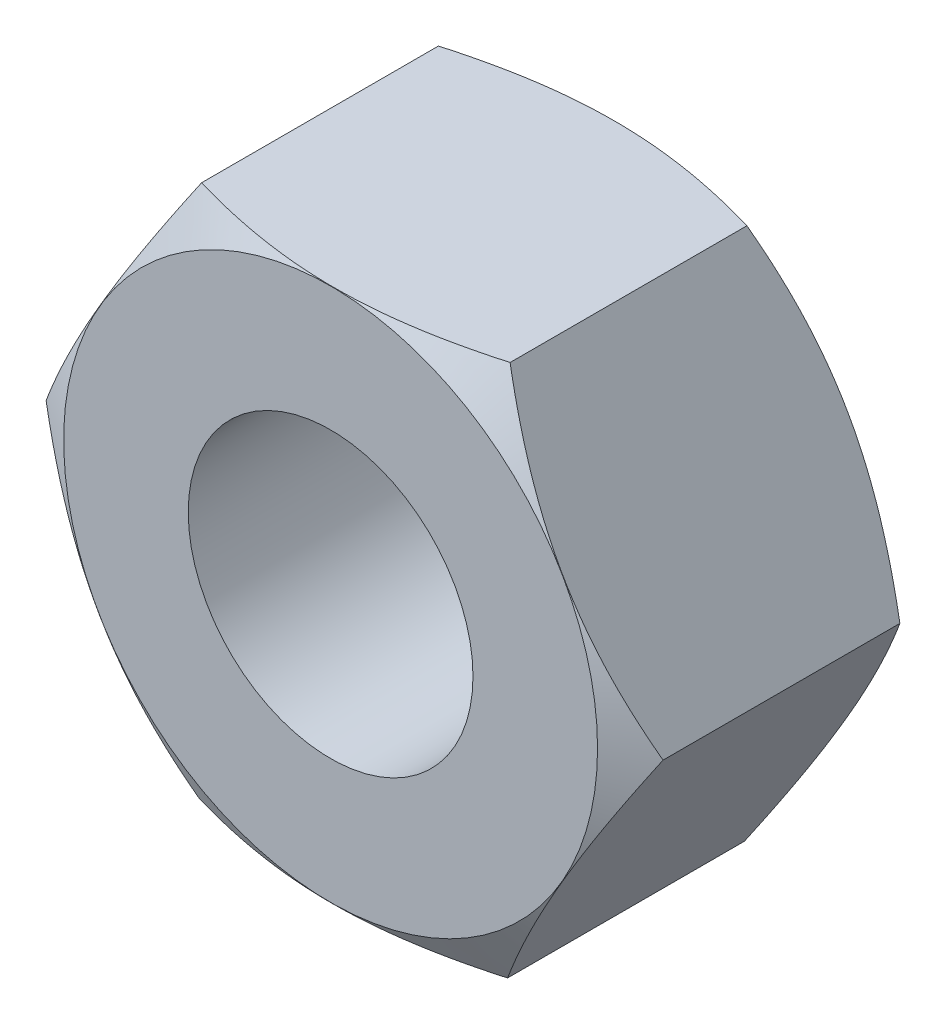
ISO-10303-21;
HEADER;
FILE_DESCRIPTION(('STEP AP214'),'2;1');
FILE_NAME('part.step','',(''),(''),'','','');
FILE_SCHEMA(('AUTOMOTIVE_DESIGN { 1 0 10303 214 1 1 1 1 }'));
ENDSEC;
DATA;
#1=APPLICATION_CONTEXT('core data for automotive mechanical design processes');
#2=APPLICATION_PROTOCOL_DEFINITION('international standard','automotive_design',2000,#1);
#3=PRODUCT_CONTEXT('',#1,'mechanical');
#4=PRODUCT('Part','Part','',(#3));
#5=PRODUCT_RELATED_PRODUCT_CATEGORY('part','',(#4));
#6=PRODUCT_DEFINITION_FORMATION('','',#4);
#7=PRODUCT_DEFINITION_CONTEXT('part definition',#1,'design');
#8=PRODUCT_DEFINITION('design','',#6,#7);
#9=PRODUCT_DEFINITION_SHAPE('','',#8);
#10=(LENGTH_UNIT() NAMED_UNIT(*) SI_UNIT(.MILLI.,.METRE.));
#11=(NAMED_UNIT(*) PLANE_ANGLE_UNIT() SI_UNIT($,.RADIAN.));
#12=(NAMED_UNIT(*) SI_UNIT($,.STERADIAN.) SOLID_ANGLE_UNIT());
#13=UNCERTAINTY_MEASURE_WITH_UNIT(LENGTH_MEASURE(1.E-05),#10,'distance_accuracy_value','');
#14=(GEOMETRIC_REPRESENTATION_CONTEXT(3) GLOBAL_UNCERTAINTY_ASSIGNED_CONTEXT((#13)) GLOBAL_UNIT_ASSIGNED_CONTEXT((#10,
#11,#12)) REPRESENTATION_CONTEXT('',''));
#15=CARTESIAN_POINT('',(0.,0.,0.));
#16=DIRECTION('',(0.,0.,1.));
#17=DIRECTION('',(1.,0.,0.));
#18=AXIS2_PLACEMENT_3D('',#15,#16,#17);
#19=CARTESIAN_POINT('',(13.,-0.0609425211780332,12.));
#20=DIRECTION('',(-0.868359805301092,-0.495934722052659,0.));
#21=DIRECTION('',(0.495934722052659,-0.868359805301093,0.));
#22=AXIS2_PLACEMENT_3D('',#19,#20,#21);
#23=PLANE('',#22);
#24=CARTESIAN_POINT('',(13.0001142233252,-0.0611425211780327,10.9894880689773));
#25=CARTESIAN_POINT('',(12.858390362768,0.187009702264895,11.0719693592018));
#26=CARTESIAN_POINT('',(12.7161380828172,0.436087164739183,11.1507070575498));
#27=CARTESIAN_POINT('',(12.4304927669625,0.936239503002821,11.299656536959));
#28=CARTESIAN_POINT('',(12.2870993722944,1.18731500697251,11.3698655138643));
#29=CARTESIAN_POINT('',(11.8546086978719,1.94458708560742,11.5663406347631));
#30=CARTESIAN_POINT('',(11.5638041050646,2.45377309005909,11.6780945793905));
#31=CARTESIAN_POINT('',(11.1286283657313,3.21574659882064,11.8091361937624));
#32=CARTESIAN_POINT('',(10.9855573153229,3.46625769222153,11.8464649639536));
#33=CARTESIAN_POINT('',(10.6987527827818,3.96843976772958,11.9090627281168));
#34=CARTESIAN_POINT('',(10.5550192879526,4.22011077206756,11.9343314899683));
#35=CARTESIAN_POINT('',(10.2673126648552,4.72387236831695,11.9721619918839));
#36=CARTESIAN_POINT('',(10.1233400259614,4.97596210335519,11.9847388320768));
#37=CARTESIAN_POINT('',(9.83526134128138,5.48037516301093,11.9969174913542));
#38=CARTESIAN_POINT('',(9.6911552997547,5.73269848017026,11.9965197113318));
#39=CARTESIAN_POINT('',(9.4217484133363,6.20441804533557,11.9836545940808));
#40=CARTESIAN_POINT('',(9.29642835605087,6.4238479333948,11.9727565186738));
#41=CARTESIAN_POINT('',(9.04607647595022,6.86220302368,11.9413529804712));
#42=CARTESIAN_POINT('',(8.92104467415237,7.0811281891055,11.9208468380869));
#43=CARTESIAN_POINT('',(8.67133725424663,7.51835485803908,11.8705846758423));
#44=CARTESIAN_POINT('',(8.54666201648415,7.73665569557915,11.8408210159615));
#45=CARTESIAN_POINT('',(8.29789604930384,8.17223392235088,11.7725660423714));
#46=CARTESIAN_POINT('',(8.17380536020082,8.38951124099311,11.7340741354393));
#47=CARTESIAN_POINT('',(7.79712108406581,9.04906877979726,11.6045330019169));
#48=CARTESIAN_POINT('',(7.54561833171974,9.48943899657902,11.5005669992917));
#49=CARTESIAN_POINT('',(7.04636311090484,10.3636128486296,11.2646064893228));
#50=CARTESIAN_POINT('',(6.79860424994483,10.7974276768682,11.1326674006679));
#51=CARTESIAN_POINT('',(6.55266354818567,11.2280589886087,10.9894880689773));
#52=B_SPLINE_CURVE_WITH_KNOTS('',3,(#24,#25,#26,#27,#28,#29,#30,#31,#32,#33,#34,#35,#36,#37,#38,
#39,#40,#41,#42,#43,#44,#45,#46,#47,#48,#49,#50,#51),.UNSPECIFIED.,.F.,.F.,(4,2,2,2,2,2,2,2,2,2,
2,2,2,4),(0.,0.892237514242431,1.78476759751002,3.57362719473805,4.44610230666216,
5.31859421054278,6.19004684485729,7.06147255282456,7.82007846338054,8.57873803904011,
9.33802538810783,10.0973643582759,11.6494354839668,13.1984599969315),.UNSPECIFIED.);
#53=CARTESIAN_POINT('',(13.,-0.060942521178034,10.9895545573082));
#54=VERTEX_POINT('',#53);
#55=CARTESIAN_POINT('',(6.55277777151085,11.2278589886087,10.9895545573082));
#56=VERTEX_POINT('',#55);
#57=EDGE_CURVE('E101',#54,#56,#52,.T.);
#58=ORIENTED_EDGE('',*,*,#57,.F.);
#59=DIRECTION('',(0.,0.,-1.));
#60=VECTOR('',#59,1.);
#61=CARTESIAN_POINT('',(13.,-0.0609425211780332,12.));
#62=LINE('',#61,#60);
#63=CARTESIAN_POINT('',(13.,-0.0609425211780332,1.0093499194347));
#64=VERTEX_POINT('',#63);
#65=EDGE_CURVE('E70',#54,#64,#62,.T.);
#66=ORIENTED_EDGE('',*,*,#65,.T.);
#67=CARTESIAN_POINT('',(6.55266354818567,11.2280589886087,1.00941640776559));
#68=CARTESIAN_POINT('',(6.69438740874281,10.9799067651658,0.926935117541137));
#69=CARTESIAN_POINT('',(6.83663968869367,10.7308293026915,0.848197419193136));
#70=CARTESIAN_POINT('',(7.12228500454838,10.2306769644278,0.699247939783979));
#71=CARTESIAN_POINT('',(7.26567839921647,9.97960146045815,0.629038962878617));
#72=CARTESIAN_POINT('',(7.69816907363895,9.22232938182324,0.432563841979857));
#73=CARTESIAN_POINT('',(7.98897366644629,8.71314337737156,0.320809897352412));
#74=CARTESIAN_POINT('',(8.4241494057795,7.95116986861002,0.189768282980571));
#75=CARTESIAN_POINT('',(8.56722045618792,7.70065877520912,0.152439512789359));
#76=CARTESIAN_POINT('',(8.85402498872908,7.19847669970108,0.0898417486261691));
#77=CARTESIAN_POINT('',(8.99775848355821,6.9468056953631,0.0645729867746255));
#78=CARTESIAN_POINT('',(9.28546510665567,6.4430440991137,0.0267424848589919));
#79=CARTESIAN_POINT('',(9.42943774554949,6.19095436407546,0.0141656446660869));
#80=CARTESIAN_POINT('',(9.71751643022947,5.68654130441972,0.00198698538877585));
#81=CARTESIAN_POINT('',(9.86162247175614,5.43421798726039,0.0023847654111409));
#82=CARTESIAN_POINT('',(10.1310293581745,4.96249842209508,0.0152498826620954));
#83=CARTESIAN_POINT('',(10.25634941546,4.74306853403585,0.0261479580691511));
#84=CARTESIAN_POINT('',(10.5067012955606,4.30471344375066,0.0575514962717488));
#85=CARTESIAN_POINT('',(10.6317330973585,4.08578827832516,0.0780576386560724));
#86=CARTESIAN_POINT('',(10.8814405172642,3.64856160939158,0.128319800900585));
#87=CARTESIAN_POINT('',(11.0061157550267,3.4302607718515,0.15808346078142));
#88=CARTESIAN_POINT('',(11.254881722207,2.99468254507977,0.226338434371495));
#89=CARTESIAN_POINT('',(11.37897241131,2.77740522643755,0.264830341303628));
#90=CARTESIAN_POINT('',(11.755656687445,2.11784768763339,0.394371474826066));
#91=CARTESIAN_POINT('',(12.0071594397911,1.67747747085164,0.498337477451205));
#92=CARTESIAN_POINT('',(12.506414660606,0.803303618801104,0.734297987420151));
#93=CARTESIAN_POINT('',(12.754173521566,0.369488790562471,0.866237076075012));
#94=CARTESIAN_POINT('',(13.0001142233252,-0.0611425211780342,1.00941640776559));
#95=B_SPLINE_CURVE_WITH_KNOTS('',3,(#67,#68,#69,#70,#71,#72,#73,#74,#75,#76,#77,#78,#79,#80,#81,
#82,#83,#84,#85,#86,#87,#88,#89,#90,#91,#92,#93,#94),.UNSPECIFIED.,.F.,.F.,(4,2,2,2,2,2,2,2,2,2,
2,2,2,4),(0.,0.892237514242429,1.78476759751002,3.57362719473805,4.44610230666216,
5.31859421054278,6.1900468448573,7.06147255282456,7.82007846338054,8.57873803904012,
9.33802538810783,10.0973643582759,11.6494354839668,13.1984599969315),.UNSPECIFIED.);
#96=CARTESIAN_POINT('',(6.55277777151085,11.2278589886087,1.0093499194347));
#97=VERTEX_POINT('',#96);
#98=EDGE_CURVE('E136',#97,#64,#95,.T.);
#99=ORIENTED_EDGE('',*,*,#98,.F.);
#100=DIRECTION('',(0.,0.,-1.));
#101=VECTOR('',#100,1.);
#102=CARTESIAN_POINT('',(6.55277777151085,11.2278589886087,12.));
#103=LINE('',#102,#101);
#104=EDGE_CURVE('E55',#56,#97,#103,.T.);
#105=ORIENTED_EDGE('',*,*,#104,.F.);
#106=EDGE_LOOP('',(#58,#66,#99,#105));
#107=FACE_BOUND('',#106,.T.);
#108=ADVANCED_FACE('F41',(#107),#23,.F.);
#109=CARTESIAN_POINT('',(6.55277777151085,11.2278589886087,12.));
#110=DIRECTION('',(-0.00468783473416895,-0.999989012042385,0.));
#111=DIRECTION('',(0.999989012042385,-0.00468783473416896,0.));
#112=AXIS2_PLACEMENT_3D('',#109,#110,#111);
#113=PLANE('',#112);
#114=CARTESIAN_POINT('',(6.55297777151085,11.2278580510314,10.9894968209807));
#115=CARTESIAN_POINT('',(6.26720996700583,11.2291976979913,11.0719777490876));
#116=CARTESIAN_POINT('',(5.9803766735506,11.2305423398421,11.1507150765607));
#117=CARTESIAN_POINT('',(5.40440990326509,11.2332424065418,11.2996637981598));
#118=CARTESIAN_POINT('',(5.1152757030346,11.2345978347819,11.3698723881261));
#119=CARTESIAN_POINT('',(4.24321432356986,11.238685959327,11.5663463211511));
#120=CARTESIAN_POINT('',(3.6568445776954,11.2414347939929,11.6780994443527));
#121=CARTESIAN_POINT('',(2.77936914453105,11.2455482990059,11.8091398347527));
#122=CARTESIAN_POINT('',(2.49088491225243,11.2469006802701,11.8464682046262));
#123=CARTESIAN_POINT('',(1.9125807544897,11.2496117043764,11.9090651719441));
#124=CARTESIAN_POINT('',(1.62276080340473,11.2509703473384,11.9343335372637));
#125=CARTESIAN_POINT('',(1.04263772466518,11.2536898983394,11.9721632601373));
#126=CARTESIAN_POINT('',(0.752335583741855,11.2550508017525,11.9847397176609));
#127=CARTESIAN_POINT('',(0.171462320990867,11.2577738695308,11.9969176347689));
#128=CARTESIAN_POINT('',(-0.119108792248342,11.2591360338556,11.996519495258));
#129=CARTESIAN_POINT('',(-0.662330800516122,11.2616825968358,11.9836537827448));
#130=CARTESIAN_POINT('',(-0.915020438643168,11.2628671771145,11.972755544028));
#131=CARTESIAN_POINT('',(-1.41981852927984,11.2652336131398,11.9413518562005));
#132=CARTESIAN_POINT('',(-1.67192693941198,11.2664154686878,11.9208457275315));
#133=CARTESIAN_POINT('',(-2.17542556564722,11.2687758129718,11.8705837629963));
#134=CARTESIAN_POINT('',(-2.42681501486396,11.2699542981128,11.8408202874613));
#135=CARTESIAN_POINT('',(-2.92841534666585,11.2723057434085,11.7725658402012));
#136=CARTESIAN_POINT('',(-3.17862614796432,11.2734787031821,11.7340742752754));
#137=CARTESIAN_POINT('',(-3.93815501426857,11.2770392881067,11.6045344210225));
#138=CARTESIAN_POINT('',(-4.44527359259478,11.2794166023144,11.5005695893827));
#139=CARTESIAN_POINT('',(-5.45194893670825,11.2841357818127,11.264611866366));
#140=CARTESIAN_POINT('',(-5.95151859158824,11.286477707526,11.1326743914679));
#141=CARTESIAN_POINT('',(-6.44742222848915,11.288802447364,10.9894968209807));
#142=B_SPLINE_CURVE_WITH_KNOTS('',3,(#114,#115,#116,#117,#118,#119,#120,#121,#122,#123,#124,
#125,#126,#127,#128,#129,#130,#131,#132,#133,#134,#135,#136,#137,#138,#139,#140,#141),
.UNSPECIFIED.,.F.,.F.,(4,2,2,2,2,2,2,2,2,2,2,2,2,4),(0.,0.892236477010448,1.7847655225682,
3.57362298715017,4.44609716022439,5.31858812556302,6.19003983232578,7.06146461194587,
7.82006381141258,8.57871667408995,9.33799728725476,10.0973295200569,11.6493864661851,
13.1983969001236),.UNSPECIFIED.);
#143=CARTESIAN_POINT('',(-6.44722222848915,11.2888015097867,10.9895545573082));
#144=VERTEX_POINT('',#143);
#145=EDGE_CURVE('E109',#56,#144,#142,.T.);
#146=ORIENTED_EDGE('',*,*,#145,.F.);
#147=ORIENTED_EDGE('',*,*,#104,.T.);
#148=CARTESIAN_POINT('',(-6.44742222848915,11.288802447364,1.00940765576219));
#149=CARTESIAN_POINT('',(-6.16165442398413,11.2874628004041,0.926926727655293));
#150=CARTESIAN_POINT('',(-5.8748211305289,11.2861181585533,0.848189400182254));
#151=CARTESIAN_POINT('',(-5.2988543602434,11.2834180918536,0.69924067858316));
#152=CARTESIAN_POINT('',(-5.0097201600129,11.2820626636135,0.629032088616801));
#153=CARTESIAN_POINT('',(-4.13765878054816,11.2779745390684,0.432558155591868));
#154=CARTESIAN_POINT('',(-3.5512890346737,11.2752257044025,0.320805032390283));
#155=CARTESIAN_POINT('',(-2.67381360150935,11.2711121993896,0.189764641990258));
#156=CARTESIAN_POINT('',(-2.38532936923074,11.2697598181253,0.15243627211678));
#157=CARTESIAN_POINT('',(-1.807025211468,11.267048794019,0.0898393047988398));
#158=CARTESIAN_POINT('',(-1.51720526038303,11.265690151057,0.0645709394792461));
#159=CARTESIAN_POINT('',(-0.93708218164348,11.262970600056,0.0267412166056155));
#160=CARTESIAN_POINT('',(-0.646780040720158,11.2616096966429,0.0141647590820029));
#161=CARTESIAN_POINT('',(-0.0659067779691692,11.2588866288646,0.00198684197405607));
#162=CARTESIAN_POINT('',(0.224664335270039,11.2575244645399,0.00238498148493948));
#163=CARTESIAN_POINT('',(0.767886343537819,11.2549779015596,0.0152506939981166));
#164=CARTESIAN_POINT('',(1.02057598166486,11.2537933212809,0.0261489327148855));
#165=CARTESIAN_POINT('',(1.52537407230154,11.2514268852556,0.0575526205424148));
#166=CARTESIAN_POINT('',(1.77748248243368,11.2502450297076,0.0780587492114774));
#167=CARTESIAN_POINT('',(2.28098110866891,11.2478846854236,0.128320713746666));
#168=CARTESIAN_POINT('',(2.53237055788566,11.2467062002826,0.158084189281592));
#169=CARTESIAN_POINT('',(3.03397088968755,11.2443547549869,0.226338636541696));
#170=CARTESIAN_POINT('',(3.28418169098601,11.2431817952133,0.264830201467503));
#171=CARTESIAN_POINT('',(4.04371055729026,11.2396212102887,0.394370055720464));
#172=CARTESIAN_POINT('',(4.55082913561648,11.237243896081,0.49833488736019));
#173=CARTESIAN_POINT('',(5.55750447972995,11.2325247165827,0.734292610376924));
#174=CARTESIAN_POINT('',(6.05707413460993,11.2301827908694,0.866230085275006));
#175=CARTESIAN_POINT('',(6.55297777151085,11.2278580510314,1.00940765576219));
#176=B_SPLINE_CURVE_WITH_KNOTS('',3,(#148,#149,#150,#151,#152,#153,#154,#155,#156,#157,#158,
#159,#160,#161,#162,#163,#164,#165,#166,#167,#168,#169,#170,#171,#172,#173,#174,#175),
.UNSPECIFIED.,.F.,.F.,(4,2,2,2,2,2,2,2,2,2,2,2,2,4),(0.,0.892236477010448,1.7847655225682,
3.57362298715017,4.44609716022439,5.31858812556302,6.19003983232579,7.06146461194587,
7.82006381141258,8.57871667408995,9.33799728725475,10.0973295200569,11.6493864661851,
13.1983969001236),.UNSPECIFIED.);
#177=CARTESIAN_POINT('',(-6.44722222848915,11.2888015097867,1.0093499194347));
#178=VERTEX_POINT('',#177);
#179=EDGE_CURVE('E132',#178,#97,#176,.T.);
#180=ORIENTED_EDGE('',*,*,#179,.F.);
#181=DIRECTION('',(0.,0.,-1.));
#182=VECTOR('',#181,1.);
#183=CARTESIAN_POINT('',(-6.44722222848915,11.2888015097867,12.));
#184=LINE('',#183,#182);
#185=EDGE_CURVE('E126',#144,#178,#184,.T.);
#186=ORIENTED_EDGE('',*,*,#185,.F.);
#187=EDGE_LOOP('',(#146,#147,#180,#186));
#188=FACE_BOUND('',#187,.T.);
#189=ADVANCED_FACE('F130',(#188),#113,.F.);
#190=CARTESIAN_POINT('',(-6.44722222848915,11.2888015097867,12.));
#191=DIRECTION('',(0.863671970566924,-0.504054289989725,0.));
#192=DIRECTION('',(0.504054289989725,0.863671970566924,0.));
#193=AXIS2_PLACEMENT_3D('',#190,#191,#192);
#194=PLANE('',#193);
#195=CARTESIAN_POINT('',(-6.44710550493966,11.2890015097867,10.9894877080875));
#196=CARTESIAN_POINT('',(-6.59114970947426,11.0421889254088,11.0719690132438));
#197=CARTESIAN_POINT('',(-6.73573098484376,10.7944560968518,11.1507067268849));
#198=CARTESIAN_POINT('',(-7.02605296838859,10.2970038092576,11.2996562375424));
#199=CARTESIAN_POINT('',(-7.17179404120198,10.0472837254312,11.3698652304032));
#200=CARTESIAN_POINT('',(-7.61136557861371,9.29409974612362,11.5663404002839));
#201=CARTESIAN_POINT('',(-7.9069313090734,8.78766255884489,11.6780943787829));
#202=CARTESIAN_POINT('',(-8.34923187271593,8.02980252874418,11.8091360436253));
#203=CARTESIAN_POINT('',(-8.49464532380855,7.78064380845106,11.8464648303236));
#204=CARTESIAN_POINT('',(-8.786145503544,7.28117274024954,11.9090626273448));
#205=CARTESIAN_POINT('',(-8.93223224509109,7.03086037023033,11.9343314055473));
#206=CARTESIAN_POINT('',(-9.22464928524705,6.5298183072732,11.9721619395868));
#207=CARTESIAN_POINT('',(-9.37097908646862,6.27908946658369,11.9847387955591));
#208=CARTESIAN_POINT('',(-9.66377428032968,5.77739945604996,11.9969174854398));
#209=CARTESIAN_POINT('',(-9.81023966863996,5.52643829362366,11.996519720241));
#210=CARTESIAN_POINT('',(-10.0840574055736,5.05726521221112,11.9836546275358));
#211=CARTESIAN_POINT('',(-10.2114292810627,4.83901983491116,11.9727565588629));
#212=CARTESIAN_POINT('',(-10.4658800784742,4.40303104168576,11.9413530268303));
#213=CARTESIAN_POINT('',(-10.5929589790351,4.18528766236216,11.9208468838805));
#214=CARTESIAN_POINT('',(-10.8467547648367,3.75042119897138,11.8705847134835));
#215=CARTESIAN_POINT('',(-10.9734712635041,3.5332987772781,11.8408210460012));
#216=CARTESIAN_POINT('',(-11.2263101823658,3.10007185782524,11.7725660507079));
#217=CARTESIAN_POINT('',(-11.3524325615851,2.88396743027411,11.7340741296731));
#218=CARTESIAN_POINT('',(-11.7352841498732,2.22797026437715,11.6045329433999));
#219=CARTESIAN_POINT('',(-11.9909046639611,1.78997721977051,11.5005668924891));
#220=CARTESIAN_POINT('',(-12.4983340044308,0.920522267971705,11.2646062675998));
#221=CARTESIAN_POINT('',(-12.7501493279747,0.489049228215312,11.1326671124015));
#222=CARTESIAN_POINT('',(-13.0001167235495,0.0607425211780319,10.9894877080875));
#223=B_SPLINE_CURVE_WITH_KNOTS('',3,(#195,#196,#197,#198,#199,#200,#201,#202,#203,#204,#205,
#206,#207,#208,#209,#210,#211,#212,#213,#214,#215,#216,#217,#218,#219,#220,#221,#222),
.UNSPECIFIED.,.F.,.F.,(4,2,2,2,2,2,2,2,2,2,2,2,2,4),(0.,0.892237557012809,1.78476768307048,
3.57362736823841,4.4461025188761,5.31859446145761,6.19004713401983,7.06147288026761,
7.82007906755555,8.57873892002515,9.33802654684803,10.0973657948316,11.6494375052174,
13.1984625987313),.UNSPECIFIED.);
#224=CARTESIAN_POINT('',(-13.,0.0609425211780319,10.9895545573082));
#225=VERTEX_POINT('',#224);
#226=EDGE_CURVE('E194',#144,#225,#223,.T.);
#227=ORIENTED_EDGE('',*,*,#226,.F.);
#228=ORIENTED_EDGE('',*,*,#185,.T.);
#229=CARTESIAN_POINT('',(-13.0001167235495,0.0607425211780314,1.00941676865546));
#230=CARTESIAN_POINT('',(-12.8560725190149,0.307555105555953,0.926935463499084));
#231=CARTESIAN_POINT('',(-12.7114912436454,0.555287934112972,0.848197749858043));
#232=CARTESIAN_POINT('',(-12.4211692601006,1.05274022170717,0.699248239200567));
#233=CARTESIAN_POINT('',(-12.2754281872872,1.30246030553355,0.629039246339764));
#234=CARTESIAN_POINT('',(-11.8358566498754,2.05564428484113,0.432564076458989));
#235=CARTESIAN_POINT('',(-11.5402909194157,2.56208147211987,0.320810097960021));
#236=CARTESIAN_POINT('',(-11.0979903557732,3.31994150222058,0.18976843311765));
#237=CARTESIAN_POINT('',(-10.9525769046806,3.56910022251369,0.152439646419319));
#238=CARTESIAN_POINT('',(-10.6610767249452,4.06857129071521,0.0898418493981774));
#239=CARTESIAN_POINT('',(-10.5149899833981,4.31888366073442,0.0645730711956182));
#240=CARTESIAN_POINT('',(-10.2225729432421,4.81992572369156,0.0267425371561437));
#241=CARTESIAN_POINT('',(-10.0762431420205,5.07065456438106,0.0141656811838473));
#242=CARTESIAN_POINT('',(-9.78344794815947,5.57234457491479,0.00198699130313268));
#243=CARTESIAN_POINT('',(-9.63698255984919,5.82330573734109,0.00238475650196202));
#244=CARTESIAN_POINT('',(-9.36316482291551,6.29247881875364,0.0152498492071277));
#245=CARTESIAN_POINT('',(-9.23579294742642,6.51072419605359,0.0261479178800018));
#246=CARTESIAN_POINT('',(-8.98134215001493,6.94671298927899,0.0575514499126465));
#247=CARTESIAN_POINT('',(-8.85426324945401,7.16445636860259,0.0780575928624555));
#248=CARTESIAN_POINT('',(-8.60046746365249,7.59932283199338,0.128319763259425));
#249=CARTESIAN_POINT('',(-8.47375096498504,7.81644525368665,0.158083430741739));
#250=CARTESIAN_POINT('',(-8.2209120461234,8.24967217313951,0.22633842603502));
#251=CARTESIAN_POINT('',(-8.0947896669041,8.46577660069064,0.264830347069797));
#252=CARTESIAN_POINT('',(-7.71193807861599,9.1217737665876,0.394371533343008));
#253=CARTESIAN_POINT('',(-7.45631756452808,9.55976681119425,0.498337584253869));
#254=CARTESIAN_POINT('',(-6.94888822405831,10.4292217629931,0.734298209143134));
#255=CARTESIAN_POINT('',(-6.6970729005144,10.8606948027494,0.866237364341461));
#256=CARTESIAN_POINT('',(-6.44710550493966,11.2890015097867,1.00941676865547));
#257=B_SPLINE_CURVE_WITH_KNOTS('',3,(#229,#230,#231,#232,#233,#234,#235,#236,#237,#238,#239,
#240,#241,#242,#243,#244,#245,#246,#247,#248,#249,#250,#251,#252,#253,#254,#255,#256),
.UNSPECIFIED.,.F.,.F.,(4,2,2,2,2,2,2,2,2,2,2,2,2,4),(0.,0.892237557012806,1.78476768307048,
3.57362736823841,4.4461025188761,5.31859446145761,6.19004713401983,7.0614728802676,
7.82007906755554,8.57873892002514,9.33802654684802,10.0973657948316,11.6494375052174,
13.1984625987313),.UNSPECIFIED.);
#258=CARTESIAN_POINT('',(-13.,0.0609425211780316,1.00934991943469));
#259=VERTEX_POINT('',#258);
#260=EDGE_CURVE('E139',#259,#178,#257,.T.);
#261=ORIENTED_EDGE('',*,*,#260,.F.);
#262=DIRECTION('',(0.,0.,-1.));
#263=VECTOR('',#262,1.);
#264=CARTESIAN_POINT('',(-13.,0.0609425211780314,12.));
#265=LINE('',#264,#263);
#266=EDGE_CURVE('E124',#225,#259,#265,.T.);
#267=ORIENTED_EDGE('',*,*,#266,.F.);
#268=EDGE_LOOP('',(#227,#228,#261,#267));
#269=FACE_BOUND('',#268,.T.);
#270=ADVANCED_FACE('F185',(#269),#194,.F.);
#271=CARTESIAN_POINT('',(-13.,0.0609425211780314,12.));
#272=DIRECTION('',(0.868359805301092,0.495934722052659,0.));
#273=DIRECTION('',(-0.495934722052659,0.868359805301093,0.));
#274=AXIS2_PLACEMENT_3D('',#271,#272,#273);
#275=PLANE('',#274);
#276=CARTESIAN_POINT('',(-13.0001142233252,0.0611425211780312,10.9894880689773));
#277=CARTESIAN_POINT('',(-12.858390362768,-0.187009702264896,11.0719693592018));
#278=CARTESIAN_POINT('',(-12.7161380828172,-0.436087164739184,11.1507070575498));
#279=CARTESIAN_POINT('',(-12.4304927669625,-0.936239503002822,11.299656536959));
#280=CARTESIAN_POINT('',(-12.2870993722944,-1.18731500697251,11.3698655138643));
#281=CARTESIAN_POINT('',(-11.8546086978719,-1.94458708560742,11.5663406347631));
#282=CARTESIAN_POINT('',(-11.5638041050646,-2.45377309005909,11.6780945793905));
#283=CARTESIAN_POINT('',(-11.1286283657313,-3.21574659882064,11.8091361937624));
#284=CARTESIAN_POINT('',(-10.9855573153229,-3.46625769222153,11.8464649639536));
#285=CARTESIAN_POINT('',(-10.6987527827818,-3.96843976772958,11.9090627281168));
#286=CARTESIAN_POINT('',(-10.5550192879526,-4.22011077206756,11.9343314899683));
#287=CARTESIAN_POINT('',(-10.2673126648552,-4.72387236831696,11.9721619918839));
#288=CARTESIAN_POINT('',(-10.1233400259614,-4.97596210335519,11.9847388320768));
#289=CARTESIAN_POINT('',(-9.83526134128138,-5.48037516301094,11.9969174913542));
#290=CARTESIAN_POINT('',(-9.6911552997547,-5.73269848017026,11.9965197113318));
#291=CARTESIAN_POINT('',(-9.4217484133363,-6.20441804533557,11.9836545940808));
#292=CARTESIAN_POINT('',(-9.29642835605086,-6.4238479333948,11.9727565186738));
#293=CARTESIAN_POINT('',(-9.04607647595022,-6.86220302368,11.9413529804712));
#294=CARTESIAN_POINT('',(-8.92104467415237,-7.0811281891055,11.9208468380869));
#295=CARTESIAN_POINT('',(-8.67133725424663,-7.51835485803908,11.8705846758423));
#296=CARTESIAN_POINT('',(-8.54666201648415,-7.73665569557915,11.8408210159615));
#297=CARTESIAN_POINT('',(-8.29789604930384,-8.17223392235088,11.7725660423714));
#298=CARTESIAN_POINT('',(-8.17380536020082,-8.38951124099311,11.7340741354393));
#299=CARTESIAN_POINT('',(-7.79712108406581,-9.04906877979727,11.6045330019169));
#300=CARTESIAN_POINT('',(-7.54561833171974,-9.48943899657902,11.5005669992917));
#301=CARTESIAN_POINT('',(-7.04636311090483,-10.3636128486296,11.2646064893228));
#302=CARTESIAN_POINT('',(-6.79860424994483,-10.7974276768682,11.1326674006679));
#303=CARTESIAN_POINT('',(-6.55266354818567,-11.2280589886087,10.9894880689773));
#304=B_SPLINE_CURVE_WITH_KNOTS('',3,(#276,#277,#278,#279,#280,#281,#282,#283,#284,#285,#286,
#287,#288,#289,#290,#291,#292,#293,#294,#295,#296,#297,#298,#299,#300,#301,#302,#303),
.UNSPECIFIED.,.F.,.F.,(4,2,2,2,2,2,2,2,2,2,2,2,2,4),(0.,0.892237514242431,1.78476759751002,
3.57362719473805,4.44610230666216,5.31859421054278,6.19004684485729,7.06147255282456,
7.82007846338054,8.57873803904012,9.33802538810783,10.0973643582759,11.6494354839668,
13.1984599969315),.UNSPECIFIED.);
#305=CARTESIAN_POINT('',(-6.55277777151085,-11.2278589886087,10.9895545573082));
#306=VERTEX_POINT('',#305);
#307=EDGE_CURVE('E201',#225,#306,#304,.T.);
#308=ORIENTED_EDGE('',*,*,#307,.F.);
#309=ORIENTED_EDGE('',*,*,#266,.T.);
#310=CARTESIAN_POINT('',(-6.55266354818567,-11.2280589886087,1.00941640776559));
#311=CARTESIAN_POINT('',(-6.69438740874281,-10.9799067651658,0.926935117541137));
#312=CARTESIAN_POINT('',(-6.83663968869367,-10.7308293026915,0.848197419193136));
#313=CARTESIAN_POINT('',(-7.12228500454838,-10.2306769644278,0.699247939783979));
#314=CARTESIAN_POINT('',(-7.26567839921647,-9.97960146045815,0.629038962878616));
#315=CARTESIAN_POINT('',(-7.69816907363895,-9.22232938182324,0.432563841979855));
#316=CARTESIAN_POINT('',(-7.98897366644629,-8.71314337737156,0.320809897352411));
#317=CARTESIAN_POINT('',(-8.4241494057795,-7.95116986861002,0.18976828298057));
#318=CARTESIAN_POINT('',(-8.56722045618792,-7.70065877520912,0.152439512789359));
#319=CARTESIAN_POINT('',(-8.85402498872908,-7.19847669970108,0.0898417486261685));
#320=CARTESIAN_POINT('',(-8.99775848355821,-6.9468056953631,0.0645729867746247));
#321=CARTESIAN_POINT('',(-9.28546510665567,-6.4430440991137,0.0267424848589912));
#322=CARTESIAN_POINT('',(-9.42943774554949,-6.19095436407546,0.0141656446660867));
#323=CARTESIAN_POINT('',(-9.71751643022946,-5.68654130441972,0.0019869853887751));
#324=CARTESIAN_POINT('',(-9.86162247175614,-5.43421798726039,0.00238476541113922));
#325=CARTESIAN_POINT('',(-10.1310293581745,-4.96249842209509,0.0152498826620936));
#326=CARTESIAN_POINT('',(-10.25634941546,-4.74306853403585,0.0261479580691499));
#327=CARTESIAN_POINT('',(-10.5067012955606,-4.30471344375066,0.0575514962717486));
#328=CARTESIAN_POINT('',(-10.6317330973585,-4.08578827832516,0.0780576386560726));
#329=CARTESIAN_POINT('',(-10.8814405172642,-3.64856160939158,0.128319800900585));
#330=CARTESIAN_POINT('',(-11.0061157550267,-3.43026077185151,0.158083460781419));
#331=CARTESIAN_POINT('',(-11.254881722207,-2.99468254507978,0.226338434371494));
#332=CARTESIAN_POINT('',(-11.37897241131,-2.77740522643755,0.264830341303627));
#333=CARTESIAN_POINT('',(-11.755656687445,-2.11784768763339,0.394371474826064));
#334=CARTESIAN_POINT('',(-12.0071594397911,-1.67747747085164,0.498337477451204));
#335=CARTESIAN_POINT('',(-12.506414660606,-0.803303618801106,0.73429798742015));
#336=CARTESIAN_POINT('',(-12.754173521566,-0.369488790562473,0.866237076075012));
#337=CARTESIAN_POINT('',(-13.0001142233252,0.0611425211780325,1.00941640776559));
#338=B_SPLINE_CURVE_WITH_KNOTS('',3,(#310,#311,#312,#313,#314,#315,#316,#317,#318,#319,#320,
#321,#322,#323,#324,#325,#326,#327,#328,#329,#330,#331,#332,#333,#334,#335,#336,#337),
.UNSPECIFIED.,.F.,.F.,(4,2,2,2,2,2,2,2,2,2,2,2,2,4),(0.,0.89223751424243,1.78476759751002,
3.57362719473805,4.44610230666216,5.31859421054278,6.1900468448573,7.06147255282457,
7.82007846338054,8.57873803904012,9.33802538810783,10.0973643582759,11.6494354839668,
13.1984599969315),.UNSPECIFIED.);
#339=CARTESIAN_POINT('',(-6.55277777151085,-11.2278589886087,1.0093499194347));
#340=VERTEX_POINT('',#339);
#341=EDGE_CURVE('E174',#340,#259,#338,.T.);
#342=ORIENTED_EDGE('',*,*,#341,.F.);
#343=DIRECTION('',(0.,0.,-1.));
#344=VECTOR('',#343,1.);
#345=CARTESIAN_POINT('',(-6.55277777151085,-11.2278589886087,12.));
#346=LINE('',#345,#344);
#347=EDGE_CURVE('E116',#306,#340,#346,.T.);
#348=ORIENTED_EDGE('',*,*,#347,.F.);
#349=EDGE_LOOP('',(#308,#309,#342,#348));
#350=FACE_BOUND('',#349,.T.);
#351=ADVANCED_FACE('F188',(#350),#275,.F.);
#352=CARTESIAN_POINT('',(-6.55277777151085,-11.2278589886087,12.));
#353=DIRECTION('',(0.00468783473416882,0.999989012042385,0.));
#354=DIRECTION('',(-0.999989012042385,0.00468783473416882,0.));
#355=AXIS2_PLACEMENT_3D('',#352,#353,#354);
#356=PLANE('',#355);
#357=CARTESIAN_POINT('',(-6.55297777151085,-11.2278580510314,10.9894968209807));
#358=CARTESIAN_POINT('',(-6.26720996700583,-11.2291976979913,11.0719777490876));
#359=CARTESIAN_POINT('',(-5.98037667355059,-11.2305423398421,11.1507150765607));
#360=CARTESIAN_POINT('',(-5.40440990326509,-11.2332424065418,11.2996637981598));
#361=CARTESIAN_POINT('',(-5.11527570303459,-11.2345978347819,11.3698723881261));
#362=CARTESIAN_POINT('',(-4.24321432356985,-11.238685959327,11.5663463211511));
#363=CARTESIAN_POINT('',(-3.65684457769539,-11.2414347939929,11.6780994443526));
#364=CARTESIAN_POINT('',(-2.77936914453105,-11.2455482990059,11.8091398347527));
#365=CARTESIAN_POINT('',(-2.49088491225243,-11.2469006802701,11.8464682046262));
#366=CARTESIAN_POINT('',(-1.91258075448969,-11.2496117043764,11.9090651719441));
#367=CARTESIAN_POINT('',(-1.62276080340473,-11.2509703473385,11.9343335372637));
#368=CARTESIAN_POINT('',(-1.04263772466517,-11.2536898983394,11.9721632601373));
#369=CARTESIAN_POINT('',(-0.752335583741852,-11.2550508017525,11.9847397176609));
#370=CARTESIAN_POINT('',(-0.171462320990864,-11.2577738695308,11.9969176347689));
#371=CARTESIAN_POINT('',(0.119108792248345,-11.2591360338556,11.996519495258));
#372=CARTESIAN_POINT('',(0.662330800516125,-11.2616825968358,11.9836537827448));
#373=CARTESIAN_POINT('',(0.91502043864317,-11.2628671771145,11.972755544028));
#374=CARTESIAN_POINT('',(1.41981852927984,-11.2652336131398,11.9413518562005));
#375=CARTESIAN_POINT('',(1.67192693941198,-11.2664154686878,11.9208457275315));
#376=CARTESIAN_POINT('',(2.17542556564722,-11.2687758129718,11.8705837629963));
#377=CARTESIAN_POINT('',(2.42681501486396,-11.2699542981128,11.8408202874613));
#378=CARTESIAN_POINT('',(2.92841534666585,-11.2723057434085,11.7725658402012));
#379=CARTESIAN_POINT('',(3.17862614796432,-11.2734787031821,11.7340742752754));
#380=CARTESIAN_POINT('',(3.93815501426857,-11.2770392881067,11.6045344210225));
#381=CARTESIAN_POINT('',(4.44527359259478,-11.2794166023144,11.5005695893827));
#382=CARTESIAN_POINT('',(5.45194893670825,-11.2841357818127,11.264611866366));
#383=CARTESIAN_POINT('',(5.95151859158824,-11.286477707526,11.1326743914679));
#384=CARTESIAN_POINT('',(6.44742222848915,-11.288802447364,10.9894968209807));
#385=B_SPLINE_CURVE_WITH_KNOTS('',3,(#357,#358,#359,#360,#361,#362,#363,#364,#365,#366,#367,
#368,#369,#370,#371,#372,#373,#374,#375,#376,#377,#378,#379,#380,#381,#382,#383,#384),
.UNSPECIFIED.,.F.,.F.,(4,2,2,2,2,2,2,2,2,2,2,2,2,4),(0.,0.892236477010447,1.7847655225682,
3.57362298715017,4.44609716022439,5.31858812556302,6.19003983232579,7.06146461194587,
7.82006381141258,8.57871667408994,9.33799728725475,10.0973295200569,11.6493864661851,
13.1983969001236),.UNSPECIFIED.);
#386=CARTESIAN_POINT('',(6.44722222848915,-11.2888015097867,10.9895545573082));
#387=VERTEX_POINT('',#386);
#388=EDGE_CURVE('E62',#306,#387,#385,.T.);
#389=ORIENTED_EDGE('',*,*,#388,.F.);
#390=ORIENTED_EDGE('',*,*,#347,.T.);
#391=CARTESIAN_POINT('',(6.44742222848915,-11.288802447364,1.00940765576219));
#392=CARTESIAN_POINT('',(6.16165442398413,-11.2874628004041,0.926926727655292));
#393=CARTESIAN_POINT('',(5.8748211305289,-11.2861181585533,0.848189400182254));
#394=CARTESIAN_POINT('',(5.2988543602434,-11.2834180918536,0.699240678583161));
#395=CARTESIAN_POINT('',(5.0097201600129,-11.2820626636135,0.629032088616801));
#396=CARTESIAN_POINT('',(4.13765878054816,-11.2779745390684,0.432558155591869));
#397=CARTESIAN_POINT('',(3.5512890346737,-11.2752257044025,0.320805032390285));
#398=CARTESIAN_POINT('',(2.67381360150935,-11.2711121993896,0.189764641990258));
#399=CARTESIAN_POINT('',(2.38532936923074,-11.2697598181253,0.152436272116779));
#400=CARTESIAN_POINT('',(1.807025211468,-11.267048794019,0.0898393047988392));
#401=CARTESIAN_POINT('',(1.51720526038303,-11.265690151057,0.0645709394792463));
#402=CARTESIAN_POINT('',(0.937082181643478,-11.262970600056,0.0267412166056162));
#403=CARTESIAN_POINT('',(0.646780040720157,-11.2616096966429,0.0141647590820034));
#404=CARTESIAN_POINT('',(0.0659067779691689,-11.2588866288646,0.00198684197405649));
#405=CARTESIAN_POINT('',(-0.22466433527004,-11.2575244645399,0.00238498148493999));
#406=CARTESIAN_POINT('',(-0.767886343537819,-11.2549779015596,0.0152506939981171));
#407=CARTESIAN_POINT('',(-1.02057598166486,-11.2537933212809,0.0261489327148861));
#408=CARTESIAN_POINT('',(-1.52537407230154,-11.2514268852556,0.0575526205424154));
#409=CARTESIAN_POINT('',(-1.77748248243368,-11.2502450297076,0.0780587492114781));
#410=CARTESIAN_POINT('',(-2.28098110866891,-11.2478846854236,0.128320713746666));
#411=CARTESIAN_POINT('',(-2.53237055788566,-11.2467062002826,0.158084189281592));
#412=CARTESIAN_POINT('',(-3.03397088968755,-11.2443547549869,0.226338636541696));
#413=CARTESIAN_POINT('',(-3.28418169098601,-11.2431817952133,0.264830201467504));
#414=CARTESIAN_POINT('',(-4.04371055729026,-11.2396212102887,0.394370055720465));
#415=CARTESIAN_POINT('',(-4.55082913561647,-11.237243896081,0.49833488736019));
#416=CARTESIAN_POINT('',(-5.55750447972995,-11.2325247165827,0.734292610376923));
#417=CARTESIAN_POINT('',(-6.05707413460993,-11.2301827908694,0.866230085275005));
#418=CARTESIAN_POINT('',(-6.55297777151085,-11.2278580510314,1.00940765576219));
#419=B_SPLINE_CURVE_WITH_KNOTS('',3,(#391,#392,#393,#394,#395,#396,#397,#398,#399,#400,#401,
#402,#403,#404,#405,#406,#407,#408,#409,#410,#411,#412,#413,#414,#415,#416,#417,#418),
.UNSPECIFIED.,.F.,.F.,(4,2,2,2,2,2,2,2,2,2,2,2,2,4),(0.,0.892236477010448,1.7847655225682,
3.57362298715017,4.4460971602244,5.31858812556302,6.19003983232579,7.06146461194587,
7.82006381141258,8.57871667408994,9.33799728725475,10.0973295200569,11.6493864661851,
13.1983969001236),.UNSPECIFIED.);
#420=CARTESIAN_POINT('',(6.44722222848915,-11.2888015097867,1.0093499194347));
#421=VERTEX_POINT('',#420);
#422=EDGE_CURVE('E166',#421,#340,#419,.T.);
#423=ORIENTED_EDGE('',*,*,#422,.F.);
#424=DIRECTION('',(0.,0.,-1.));
#425=VECTOR('',#424,1.);
#426=CARTESIAN_POINT('',(6.44722222848915,-11.2888015097867,12.));
#427=LINE('',#426,#425);
#428=EDGE_CURVE('E113',#387,#421,#427,.T.);
#429=ORIENTED_EDGE('',*,*,#428,.F.);
#430=EDGE_LOOP('',(#389,#390,#423,#429));
#431=FACE_BOUND('',#430,.T.);
#432=ADVANCED_FACE('F235',(#431),#356,.F.);
#433=CARTESIAN_POINT('',(6.44722222848915,-11.2888015097867,12.));
#434=DIRECTION('',(-0.863671970566924,0.504054289989725,0.));
#435=DIRECTION('',(-0.504054289989726,-0.863671970566924,0.));
#436=AXIS2_PLACEMENT_3D('',#433,#434,#435);
#437=PLANE('',#436);
#438=CARTESIAN_POINT('',(6.44710550493966,-11.2890015097867,10.9894877080875));
#439=CARTESIAN_POINT('',(6.59114970947426,-11.0421889254088,11.0719690132438));
#440=CARTESIAN_POINT('',(6.73573098484376,-10.7944560968518,11.1507067268849));
#441=CARTESIAN_POINT('',(7.02605296838859,-10.2970038092576,11.2996562375424));
#442=CARTESIAN_POINT('',(7.17179404120198,-10.0472837254312,11.3698652304032));
#443=CARTESIAN_POINT('',(7.61136557861371,-9.29409974612362,11.5663404002839));
#444=CARTESIAN_POINT('',(7.9069313090734,-8.78766255884489,11.6780943787829));
#445=CARTESIAN_POINT('',(8.34923187271593,-8.02980252874418,11.8091360436253));
#446=CARTESIAN_POINT('',(8.49464532380855,-7.78064380845106,11.8464648303236));
#447=CARTESIAN_POINT('',(8.786145503544,-7.28117274024954,11.9090626273448));
#448=CARTESIAN_POINT('',(8.93223224509109,-7.03086037023033,11.9343314055473));
#449=CARTESIAN_POINT('',(9.22464928524705,-6.5298183072732,11.9721619395868));
#450=CARTESIAN_POINT('',(9.37097908646862,-6.27908946658369,11.9847387955591));
#451=CARTESIAN_POINT('',(9.66377428032969,-5.77739945604996,11.9969174854398));
#452=CARTESIAN_POINT('',(9.81023966863996,-5.52643829362366,11.996519720241));
#453=CARTESIAN_POINT('',(10.0840574055737,-5.05726521221112,11.9836546275358));
#454=CARTESIAN_POINT('',(10.2114292810627,-4.83901983491117,11.9727565588629));
#455=CARTESIAN_POINT('',(10.4658800784742,-4.40303104168576,11.9413530268303));
#456=CARTESIAN_POINT('',(10.5929589790351,-4.18528766236216,11.9208468838805));
#457=CARTESIAN_POINT('',(10.8467547648367,-3.75042119897138,11.8705847134835));
#458=CARTESIAN_POINT('',(10.9734712635041,-3.5332987772781,11.8408210460012));
#459=CARTESIAN_POINT('',(11.2263101823658,-3.10007185782524,11.7725660507079));
#460=CARTESIAN_POINT('',(11.3524325615851,-2.88396743027411,11.7340741296731));
#461=CARTESIAN_POINT('',(11.7352841498732,-2.22797026437715,11.6045329433999));
#462=CARTESIAN_POINT('',(11.9909046639611,-1.78997721977051,11.5005668924891));
#463=CARTESIAN_POINT('',(12.4983340044308,-0.920522267971706,11.2646062675998));
#464=CARTESIAN_POINT('',(12.7501493279748,-0.489049228215313,11.1326671124015));
#465=CARTESIAN_POINT('',(13.0001167235495,-0.0607425211780321,10.9894877080875));
#466=B_SPLINE_CURVE_WITH_KNOTS('',3,(#438,#439,#440,#441,#442,#443,#444,#445,#446,#447,#448,
#449,#450,#451,#452,#453,#454,#455,#456,#457,#458,#459,#460,#461,#462,#463,#464,#465),
.UNSPECIFIED.,.F.,.F.,(4,2,2,2,2,2,2,2,2,2,2,2,2,4),(0.,0.892237557012809,1.78476768307048,
3.57362736823841,4.4461025188761,5.31859446145761,6.19004713401984,7.06147288026761,
7.82007906755555,8.57873892002515,9.33802654684803,10.0973657948316,11.6494375052174,
13.1984625987313),.UNSPECIFIED.);
#467=EDGE_CURVE('E99',#387,#54,#466,.T.);
#468=ORIENTED_EDGE('',*,*,#467,.F.);
#469=ORIENTED_EDGE('',*,*,#428,.T.);
#470=CARTESIAN_POINT('',(13.0001167235495,-0.0607425211780332,1.00941676865546));
#471=CARTESIAN_POINT('',(12.8560725190149,-0.307555105555954,0.926935463499086));
#472=CARTESIAN_POINT('',(12.7114912436454,-0.555287934112973,0.848197749858045));
#473=CARTESIAN_POINT('',(12.4211692601006,-1.05274022170718,0.699248239200568));
#474=CARTESIAN_POINT('',(12.2754281872872,-1.30246030553355,0.629039246339764));
#475=CARTESIAN_POINT('',(11.8358566498754,-2.05564428484114,0.432564076458989));
#476=CARTESIAN_POINT('',(11.5402909194158,-2.56208147211987,0.320810097960021));
#477=CARTESIAN_POINT('',(11.0979903557732,-3.31994150222058,0.189768433117651));
#478=CARTESIAN_POINT('',(10.9525769046806,-3.56910022251369,0.15243964641932));
#479=CARTESIAN_POINT('',(10.6610767249452,-4.06857129071521,0.0898418493981779));
#480=CARTESIAN_POINT('',(10.5149899833981,-4.31888366073442,0.0645730711956188));
#481=CARTESIAN_POINT('',(10.2225729432421,-4.81992572369156,0.0267425371561447));
#482=CARTESIAN_POINT('',(10.0762431420205,-5.07065456438106,0.0141656811838486));
#483=CARTESIAN_POINT('',(9.78344794815947,-5.57234457491479,0.00198699130313393));
#484=CARTESIAN_POINT('',(9.63698255984919,-5.82330573734109,0.00238475650196301));
#485=CARTESIAN_POINT('',(9.36316482291551,-6.29247881875364,0.0152498492071287));
#486=CARTESIAN_POINT('',(9.23579294742642,-6.51072419605359,0.0261479178800031));
#487=CARTESIAN_POINT('',(8.98134215001493,-6.94671298927899,0.0575514499126481));
#488=CARTESIAN_POINT('',(8.85426324945401,-7.16445636860259,0.0780575928624572));
#489=CARTESIAN_POINT('',(8.60046746365249,-7.59932283199337,0.128319763259426));
#490=CARTESIAN_POINT('',(8.47375096498504,-7.81644525368665,0.158083430741739));
#491=CARTESIAN_POINT('',(8.2209120461234,-8.24967217313951,0.226338426035019));
#492=CARTESIAN_POINT('',(8.0947896669041,-8.46577660069064,0.264830347069797));
#493=CARTESIAN_POINT('',(7.71193807861599,-9.1217737665876,0.394371533343009));
#494=CARTESIAN_POINT('',(7.45631756452808,-9.55976681119425,0.498337584253869));
#495=CARTESIAN_POINT('',(6.94888822405831,-10.4292217629931,0.734298209143133));
#496=CARTESIAN_POINT('',(6.6970729005144,-10.8606948027494,0.86623736434146));
#497=CARTESIAN_POINT('',(6.44710550493966,-11.2890015097867,1.00941676865547));
#498=B_SPLINE_CURVE_WITH_KNOTS('',3,(#470,#471,#472,#473,#474,#475,#476,#477,#478,#479,#480,
#481,#482,#483,#484,#485,#486,#487,#488,#489,#490,#491,#492,#493,#494,#495,#496,#497),
.UNSPECIFIED.,.F.,.F.,(4,2,2,2,2,2,2,2,2,2,2,2,2,4),(0.,0.892237557012807,1.78476768307048,
3.57362736823841,4.4461025188761,5.31859446145761,6.19004713401983,7.0614728802676,
7.82007906755554,8.57873892002514,9.33802654684802,10.0973657948316,11.6494375052174,
13.1984625987313),.UNSPECIFIED.);
#499=EDGE_CURVE('E12',#64,#421,#498,.T.);
#500=ORIENTED_EDGE('',*,*,#499,.F.);
#501=ORIENTED_EDGE('',*,*,#65,.F.);
#502=EDGE_LOOP('',(#468,#469,#500,#501));
#503=FACE_BOUND('',#502,.T.);
#504=ADVANCED_FACE('F112',(#503),#437,.F.);
#505=CARTESIAN_POINT('',(0.,0.,12.));
#506=DIRECTION('',(0.,0.,1.));
#507=DIRECTION('',(1.,0.,0.));
#508=AXIS2_PLACEMENT_3D('',#505,#506,#507);
#509=PLANE('',#508);
#510=CARTESIAN_POINT('',(0.,0.,12.));
#511=DIRECTION('',(0.,0.,1.));
#512=DIRECTION('',(1.,0.,0.));
#513=AXIS2_PLACEMENT_3D('',#510,#511,#512);
#514=CIRCLE('',#513,6.);
#515=CARTESIAN_POINT('',(6.,0.,12.));
#516=VERTEX_POINT('',#515);
#517=EDGE_CURVE('E114',#516,#516,#514,.T.);
#518=ORIENTED_EDGE('',*,*,#517,.F.);
#519=EDGE_LOOP('',(#518));
#520=FACE_BOUND('',#519,.T.);
#521=CARTESIAN_POINT('',(0.,0.,12.));
#522=DIRECTION('',(0.,0.,1.));
#523=DIRECTION('',(1.,0.,0.));
#524=AXIS2_PLACEMENT_3D('',#521,#522,#523);
#525=CIRCLE('',#524,11.25);
#526=CARTESIAN_POINT('',(11.25,0.,12.));
#527=VERTEX_POINT('',#526);
#528=EDGE_CURVE('E105',#527,#527,#525,.T.);
#529=ORIENTED_EDGE('',*,*,#528,.T.);
#530=EDGE_LOOP('',(#529));
#531=FACE_BOUND('',#530,.T.);
#532=ADVANCED_FACE('F243',(#520,#531),#509,.T.);
#533=CARTESIAN_POINT('',(0.,0.,0.));
#534=DIRECTION('',(0.,0.,1.));
#535=DIRECTION('',(1.,0.,0.));
#536=AXIS2_PLACEMENT_3D('',#533,#534,#535);
#537=PLANE('',#536);
#538=CARTESIAN_POINT('',(0.,0.,0.));
#539=DIRECTION('',(0.,0.,1.));
#540=DIRECTION('',(1.,0.,0.));
#541=AXIS2_PLACEMENT_3D('',#538,#539,#540);
#542=CIRCLE('',#541,6.);
#543=CARTESIAN_POINT('',(6.,0.,0.));
#544=VERTEX_POINT('',#543);
#545=EDGE_CURVE('E119',#544,#544,#542,.T.);
#546=ORIENTED_EDGE('',*,*,#545,.T.);
#547=EDGE_LOOP('',(#546));
#548=FACE_BOUND('',#547,.T.);
#549=CARTESIAN_POINT('',(0.,0.,0.));
#550=DIRECTION('',(0.,0.,-1.));
#551=DIRECTION('',(-1.,0.,0.));
#552=AXIS2_PLACEMENT_3D('',#549,#550,#551);
#553=CIRCLE('',#552,11.2518975019421);
#554=CARTESIAN_POINT('',(-11.2518975019421,0.,0.));
#555=VERTEX_POINT('',#554);
#556=EDGE_CURVE('E108',#555,#555,#553,.T.);
#557=ORIENTED_EDGE('',*,*,#556,.T.);
#558=EDGE_LOOP('',(#557));
#559=FACE_BOUND('',#558,.T.);
#560=ADVANCED_FACE('F244',(#548,#559),#537,.F.);
#561=CARTESIAN_POINT('',(0.,0.,12.));
#562=DIRECTION('',(0.,0.,-1.));
#563=DIRECTION('',(-1.,0.,0.));
#564=AXIS2_PLACEMENT_3D('',#561,#562,#563);
#565=CYLINDRICAL_SURFACE('',#564,6.);
#566=ORIENTED_EDGE('',*,*,#517,.T.);
#567=EDGE_LOOP('',(#566));
#568=FACE_BOUND('',#567,.T.);
#569=ORIENTED_EDGE('',*,*,#545,.F.);
#570=EDGE_LOOP('',(#569));
#571=FACE_BOUND('',#570,.T.);
#572=ADVANCED_FACE('F156',(#568,#571),#565,.F.);
#573=CARTESIAN_POINT('',(0.,0.,0.));
#574=DIRECTION('',(0.,0.,1.));
#575=DIRECTION('',(-1.,0.,0.));
#576=AXIS2_PLACEMENT_3D('',#573,#574,#575);
#577=CONICAL_SURFACE('',#576,11.2518975019421,1.0471975511966);
#578=ORIENTED_EDGE('',*,*,#556,.F.);
#579=EDGE_LOOP('',(#578));
#580=FACE_BOUND('',#579,.T.);
#581=ORIENTED_EDGE('',*,*,#98,.T.);
#582=ORIENTED_EDGE('',*,*,#499,.T.);
#583=ORIENTED_EDGE('',*,*,#422,.T.);
#584=ORIENTED_EDGE('',*,*,#341,.T.);
#585=ORIENTED_EDGE('',*,*,#260,.T.);
#586=ORIENTED_EDGE('',*,*,#179,.T.);
#587=EDGE_LOOP('',(#581,#582,#583,#584,#585,#586));
#588=FACE_BOUND('',#587,.T.);
#589=ADVANCED_FACE('F135',(#580,#588),#577,.T.);
#590=CARTESIAN_POINT('',(0.,0.,12.));
#591=DIRECTION('',(0.,0.,-1.));
#592=DIRECTION('',(1.,0.,0.));
#593=AXIS2_PLACEMENT_3D('',#590,#591,#592);
#594=CONICAL_SURFACE('',#593,11.25,1.0471975511966);
#595=ORIENTED_EDGE('',*,*,#528,.F.);
#596=EDGE_LOOP('',(#595));
#597=FACE_BOUND('',#596,.T.);
#598=ORIENTED_EDGE('',*,*,#57,.T.);
#599=ORIENTED_EDGE('',*,*,#145,.T.);
#600=ORIENTED_EDGE('',*,*,#226,.T.);
#601=ORIENTED_EDGE('',*,*,#307,.T.);
#602=ORIENTED_EDGE('',*,*,#388,.T.);
#603=ORIENTED_EDGE('',*,*,#467,.T.);
#604=EDGE_LOOP('',(#598,#599,#600,#601,#602,#603));
#605=FACE_BOUND('',#604,.T.);
#606=ADVANCED_FACE('F100',(#597,#605),#594,.T.);
#607=CLOSED_SHELL('',(#108,#189,#270,#351,#432,#504,#532,#560,#572,#589,#606));
#608=MANIFOLD_SOLID_BREP('B2',#607);
#609=ADVANCED_BREP_SHAPE_REPRESENTATION('',(#18,#608),#14);
#610=SHAPE_DEFINITION_REPRESENTATION(#9,#609);
ENDSEC;
END-ISO-10303-21;
